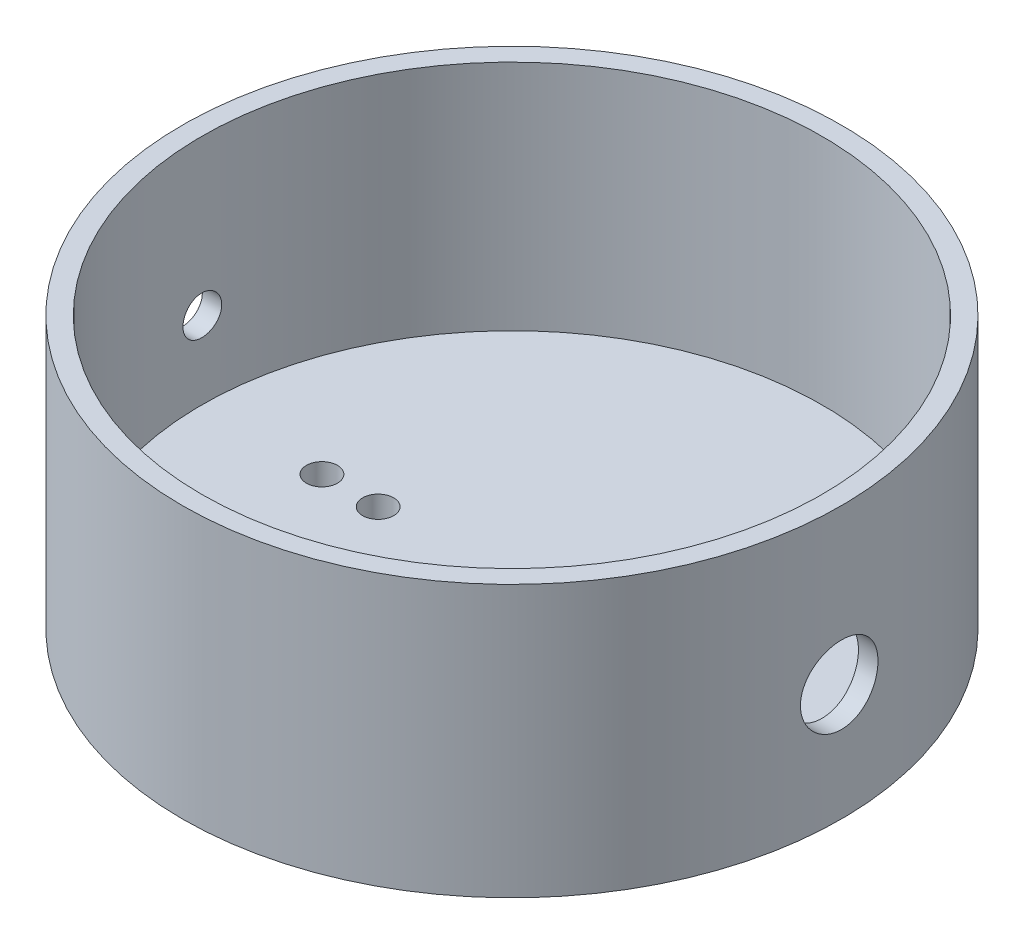
ISO-10303-21;
HEADER;
FILE_DESCRIPTION(('STEP AP214'),'2;1');
FILE_NAME('part.step','',(''),(''),'','','');
FILE_SCHEMA(('AUTOMOTIVE_DESIGN { 1 0 10303 214 1 1 1 1 }'));
ENDSEC;
DATA;
#1=APPLICATION_CONTEXT('core data for automotive mechanical design processes');
#2=APPLICATION_PROTOCOL_DEFINITION('international standard','automotive_design',2000,#1);
#3=PRODUCT_CONTEXT('',#1,'mechanical');
#4=PRODUCT('Part','Part','',(#3));
#5=PRODUCT_RELATED_PRODUCT_CATEGORY('part','',(#4));
#6=PRODUCT_DEFINITION_FORMATION('','',#4);
#7=PRODUCT_DEFINITION_CONTEXT('part definition',#1,'design');
#8=PRODUCT_DEFINITION('design','',#6,#7);
#9=PRODUCT_DEFINITION_SHAPE('','',#8);
#10=(LENGTH_UNIT() NAMED_UNIT(*) SI_UNIT(.MILLI.,.METRE.));
#11=(NAMED_UNIT(*) PLANE_ANGLE_UNIT() SI_UNIT($,.RADIAN.));
#12=(NAMED_UNIT(*) SI_UNIT($,.STERADIAN.) SOLID_ANGLE_UNIT());
#13=UNCERTAINTY_MEASURE_WITH_UNIT(LENGTH_MEASURE(1.E-05),#10,'distance_accuracy_value','');
#14=(GEOMETRIC_REPRESENTATION_CONTEXT(3) GLOBAL_UNCERTAINTY_ASSIGNED_CONTEXT((#13)) GLOBAL_UNIT_ASSIGNED_CONTEXT((#10,
#11,#12)) REPRESENTATION_CONTEXT('',''));
#15=CARTESIAN_POINT('',(0.,0.,0.));
#16=DIRECTION('',(0.,0.,1.));
#17=DIRECTION('',(1.,0.,0.));
#18=AXIS2_PLACEMENT_3D('',#15,#16,#17);
#19=CARTESIAN_POINT('',(0.,5.,0.));
#20=DIRECTION('',(0.,-1.,0.));
#21=DIRECTION('',(0.,0.,-1.));
#22=AXIS2_PLACEMENT_3D('',#19,#20,#21);
#23=CYLINDRICAL_SURFACE('',#22,42.5);
#24=CARTESIAN_POINT('',(-42.4264068711928,15.,-2.5));
#25=CARTESIAN_POINT('',(-42.4264078570195,14.8597043001764,-2.49999382069607));
#26=CARTESIAN_POINT('',(-42.4271102485507,14.7193099656528,-2.4881505905154));
#27=CARTESIAN_POINT('',(-42.4298443023052,14.4423967781573,-2.44107495642093));
#28=CARTESIAN_POINT('',(-42.4318775177309,14.3058826482556,-2.40581522244134));
#29=CARTESIAN_POINT('',(-42.4370421207025,14.0407811498357,-2.31292183504433));
#30=CARTESIAN_POINT('',(-42.4401729347905,13.9121896831655,-2.25529986345477));
#31=CARTESIAN_POINT('',(-42.4471792366281,13.6665382005797,-2.11933627438461));
#32=CARTESIAN_POINT('',(-42.4510545521376,13.5494755269407,-2.04099944769993));
#33=CARTESIAN_POINT('',(-42.4591191176081,13.3300128651671,-1.86571366309539));
#34=CARTESIAN_POINT('',(-42.4633087344733,13.2276304330584,-1.76874273962355));
#35=CARTESIAN_POINT('',(-42.4715263980762,13.0405846084043,-1.55898636943882));
#36=CARTESIAN_POINT('',(-42.4755544381152,12.9559219498848,-1.44620026791907));
#37=CARTESIAN_POINT('',(-42.482998132701,12.8066666987091,-1.20791823890995));
#38=CARTESIAN_POINT('',(-42.4864133514463,12.7420883650664,-1.08241336506772));
#39=CARTESIAN_POINT('',(-42.4922427554677,12.6349262647477,-0.822319232189798));
#40=CARTESIAN_POINT('',(-42.494656950462,12.592342284542,-0.687730061362301));
#41=CARTESIAN_POINT('',(-42.4982097643916,12.5304256739497,-0.413454591796973));
#42=CARTESIAN_POINT('',(-42.4993498707064,12.511065929495,-0.273774433523604));
#43=CARTESIAN_POINT('',(-42.5002310415814,12.496063627122,0.00685733853192212));
#44=CARTESIAN_POINT('',(-42.4999721204025,12.5004208274484,0.147808939339185));
#45=CARTESIAN_POINT('',(-42.4980856567521,12.5327063230398,0.426798862719913));
#46=CARTESIAN_POINT('',(-42.4964598081053,12.5606054465476,0.564840574170226));
#47=CARTESIAN_POINT('',(-42.492024511873,12.6391375806725,0.83427807529489));
#48=CARTESIAN_POINT('',(-42.4892150579319,12.689770713365,0.965673829278089));
#49=CARTESIAN_POINT('',(-42.4827260051383,12.8123666826543,1.21818330971254));
#50=CARTESIAN_POINT('',(-42.4790458663383,12.8843427619376,1.3392905922654));
#51=CARTESIAN_POINT('',(-42.4712296999799,13.0475718427678,1.56771494894009));
#52=CARTESIAN_POINT('',(-42.4670936678973,13.1388250356279,1.67503188618435));
#53=CARTESIAN_POINT('',(-42.4588238943725,13.3381828065811,1.87299944126679));
#54=CARTESIAN_POINT('',(-42.4546901658902,13.4463127011079,1.96362456738247));
#55=CARTESIAN_POINT('',(-42.4468973052562,13.6762656924409,2.12543949407809));
#56=CARTESIAN_POINT('',(-42.4432381732714,13.7980887940613,2.196629287825));
#57=CARTESIAN_POINT('',(-42.4368076458013,14.0519860337355,2.31755078766452));
#58=CARTESIAN_POINT('',(-42.4340362932275,14.1840606669218,2.36728145655394));
#59=CARTESIAN_POINT('',(-42.4296954187484,14.454704579978,2.44385561766896));
#60=CARTESIAN_POINT('',(-42.4281258843259,14.5932737921894,2.47069934826726));
#61=CARTESIAN_POINT('',(-42.4263679821085,14.8727511270737,2.50070595175883));
#62=CARTESIAN_POINT('',(-42.4261775486014,15.0136554346153,2.50390424256846));
#63=CARTESIAN_POINT('',(-42.427193928478,15.2939985837111,2.48662168212214));
#64=CARTESIAN_POINT('',(-42.4284007354329,15.433437432005,2.46614093981395));
#65=CARTESIAN_POINT('',(-42.4320737044637,15.7067915614793,2.40211109266647));
#66=CARTESIAN_POINT('',(-42.4345389777362,15.8407106689832,2.35857826776428));
#67=CARTESIAN_POINT('',(-42.4404502941044,16.0993418741163,2.24969647773642));
#68=CARTESIAN_POINT('',(-42.4438963450773,16.2240538977891,2.18434733739359));
#69=CARTESIAN_POINT('',(-42.4513858733169,16.4608935899571,2.0335973061375));
#70=CARTESIAN_POINT('',(-42.455430056098,16.5730061183306,1.94817266450964));
#71=CARTESIAN_POINT('',(-42.4636576065315,16.7813119104551,1.75973113167618));
#72=CARTESIAN_POINT('',(-42.4678409753961,16.8775050355068,1.65671408721101));
#73=CARTESIAN_POINT('',(-42.4758814966068,17.0513608910064,1.43585968885814));
#74=CARTESIAN_POINT('',(-42.4797382419494,17.1290007154245,1.31800428659472));
#75=CARTESIAN_POINT('',(-42.4866850712182,17.2633893657794,1.07090956169384));
#76=CARTESIAN_POINT('',(-42.4897751594339,17.3201383086034,0.941670302755459));
#77=CARTESIAN_POINT('',(-42.4948385237127,17.4110943907858,0.675561020431282));
#78=CARTESIAN_POINT('',(-42.4968125203618,17.4453160768471,0.538695983361276));
#79=CARTESIAN_POINT('',(-42.4994241327085,17.4902938331614,0.261150762104982));
#80=CARTESIAN_POINT('',(-42.5000617597742,17.5010501030309,0.120470610383584));
#81=CARTESIAN_POINT('',(-42.4999288221523,17.498789787394,-0.160484537393839));
#82=CARTESIAN_POINT('',(-42.499160382407,17.4858090748239,-0.30075982446973));
#83=CARTESIAN_POINT('',(-42.4963059653803,17.4365175779872,-0.577135569655357));
#84=CARTESIAN_POINT('',(-42.4942199857248,17.4002067516791,-0.713236020241449));
#85=CARTESIAN_POINT('',(-42.4889650214136,17.305293642282,-0.977404699258213));
#86=CARTESIAN_POINT('',(-42.4857960388101,17.2466914014315,-1.10547294290799));
#87=CARTESIAN_POINT('',(-42.4787310597193,17.1088642540061,-1.34995674095591));
#88=CARTESIAN_POINT('',(-42.4748350831844,17.0296399133852,-1.46637261502091));
#89=CARTESIAN_POINT('',(-42.4667475100763,16.8526858588465,-1.6844283370012));
#90=CARTESIAN_POINT('',(-42.4625555079513,16.754930436373,-1.78604730638879));
#91=CARTESIAN_POINT('',(-42.4543514714737,16.543719429491,-1.97146637450623));
#92=CARTESIAN_POINT('',(-42.4503394814903,16.4302600022167,-2.05526209900834));
#93=CARTESIAN_POINT('',(-42.4429445090164,16.1907448984061,-2.20271081735825));
#94=CARTESIAN_POINT('',(-42.4395622559455,16.0646748716378,-2.26634051218411));
#95=CARTESIAN_POINT('',(-42.433819174436,15.8037135794594,-2.3714525700203));
#96=CARTESIAN_POINT('',(-42.431457147064,15.6688328839112,-2.41296094272702));
#97=CARTESIAN_POINT('',(-42.4286426715959,15.4442690628895,-2.46183209483964));
#98=CARTESIAN_POINT('',(-42.4278079774903,15.3560384887053,-2.47612662547874));
#99=CARTESIAN_POINT('',(-42.426689763893,15.1785519282037,-2.49521253878567));
#100=CARTESIAN_POINT('',(-42.4264062437301,15.0892959431351,-2.50000393302698));
#101=CARTESIAN_POINT('',(-42.4264068711928,15.,-2.5));
#102=B_SPLINE_CURVE_WITH_KNOTS('',3,(#24,#25,#26,#27,#28,#29,#30,#31,#32,#33,#34,#35,#36,#37,
#38,#39,#40,#41,#42,#43,#44,#45,#46,#47,#48,#49,#50,#51,#52,#53,#54,#55,#56,#57,#58,#59,#60,#61,
#62,#63,#64,#65,#66,#67,#68,#69,#70,#71,#72,#73,#74,#75,#76,#77,#78,#79,#80,#81,#82,#83,#84,#85,
#86,#87,#88,#89,#90,#91,#92,#93,#94,#95,#96,#97,#98,#99,#100,#101),.UNSPECIFIED.,.T.,.F.,(4,2,2,
2,2,2,2,2,2,2,2,2,2,2,2,2,2,2,2,2,2,2,2,2,2,2,2,2,2,2,2,2,2,2,2,2,2,2,4),(0.,0.420561120416397,
0.841613954303946,1.26244712948578,1.68318306212284,2.10441802759387,2.52567043890264,
2.94722124231487,3.36876795307322,3.78982203170134,4.210871818381,4.63140062996588,
5.05193169970001,5.4727242448411,5.89352096628162,6.31495509401274,6.73638936991081,
7.15784401308977,7.57929426666848,8.00011311224769,8.42093002163786,8.84145013554994,
9.26197362693925,9.68299715391401,10.104024348903,10.5255686919896,10.9471106764483,
11.3683801875622,11.7896461149885,12.2102759228796,12.6309064887603,13.0515362576232,
13.4721544839179,13.8933605707046,14.3146699120255,14.7364642575989,15.1577615676481,
15.4254422426562,15.6931225916671),.UNSPECIFIED.);
#103=CARTESIAN_POINT('',(-42.4264068711928,15.,-2.5));
#104=VERTEX_POINT('',#103);
#105=EDGE_CURVE('E187',#104,#104,#102,.T.);
#106=ORIENTED_EDGE('',*,*,#105,.F.);
#107=EDGE_LOOP('',(#106));
#108=FACE_BOUND('',#107,.T.);
#109=CARTESIAN_POINT('',(0.,0.,0.));
#110=DIRECTION('',(0.,1.,0.));
#111=DIRECTION('',(0.,0.,1.));
#112=AXIS2_PLACEMENT_3D('',#109,#110,#111);
#113=CIRCLE('',#112,42.5);
#114=CARTESIAN_POINT('',(0.,0.,42.5));
#115=VERTEX_POINT('',#114);
#116=EDGE_CURVE('E60',#115,#115,#113,.T.);
#117=ORIENTED_EDGE('',*,*,#116,.T.);
#118=EDGE_LOOP('',(#117));
#119=FACE_BOUND('',#118,.T.);
#120=CARTESIAN_POINT('',(0.,35.,0.));
#121=DIRECTION('',(0.,1.,0.));
#122=DIRECTION('',(0.,0.,1.));
#123=AXIS2_PLACEMENT_3D('',#120,#121,#122);
#124=CIRCLE('',#123,42.5);
#125=CARTESIAN_POINT('',(0.,35.,42.5));
#126=VERTEX_POINT('',#125);
#127=EDGE_CURVE('E252',#126,#126,#124,.T.);
#128=ORIENTED_EDGE('',*,*,#127,.F.);
#129=EDGE_LOOP('',(#128));
#130=FACE_BOUND('',#129,.T.);
#131=CARTESIAN_POINT('',(42.2048575403353,15.,5.));
#132=CARTESIAN_POINT('',(42.2048570426154,14.8600470304673,5.00000153220892));
#133=CARTESIAN_POINT('',(42.2055550887369,14.7201168221649,4.99412181150468));
#134=CARTESIAN_POINT('',(42.2083262928634,14.4412116689668,4.97064763379723));
#135=CARTESIAN_POINT('',(42.2103997683703,14.3022369521209,4.95305047195592));
#136=CARTESIAN_POINT('',(42.2158651113569,14.0261765076074,4.90624962764263));
#137=CARTESIAN_POINT('',(42.2192579831723,13.8890923015218,4.87703710307672));
#138=CARTESIAN_POINT('',(42.2272657855913,13.617841989659,4.80720904071436));
#139=CARTESIAN_POINT('',(42.2318811637412,13.4836769720698,4.76658932654084));
#140=CARTESIAN_POINT('',(42.2421957984114,13.2194034625113,4.67429629923434));
#141=CARTESIAN_POINT('',(42.2478939341414,13.0892909363885,4.62263440929847));
#142=CARTESIAN_POINT('',(42.2602171284125,12.8338431886225,4.50858482145079));
#143=CARTESIAN_POINT('',(42.2668425281619,12.708509747256,4.44619317333116));
#144=CARTESIAN_POINT('',(42.2808268333667,12.4636134464195,4.31118117911138));
#145=CARTESIAN_POINT('',(42.2881853295911,12.3440474221644,4.23856653046959));
#146=CARTESIAN_POINT('',(42.3034341792611,12.1113974890362,4.08356714245648));
#147=CARTESIAN_POINT('',(42.3113247290178,11.9983160015476,4.00117878828372));
#148=CARTESIAN_POINT('',(42.3274462472034,11.7790195703506,3.82687638132189));
#149=CARTESIAN_POINT('',(42.3356784708233,11.6728344577479,3.73492491108491));
#150=CARTESIAN_POINT('',(42.3522235943998,11.4685391337668,3.54238529197751));
#151=CARTESIAN_POINT('',(42.3605365230633,11.3704319228451,3.44179396200909));
#152=CARTESIAN_POINT('',(42.3770029500095,11.1830523894077,3.2327400377726));
#153=CARTESIAN_POINT('',(42.3851564983579,11.0937772555156,3.12427996741562));
#154=CARTESIAN_POINT('',(42.4010802245308,10.9246228026331,2.90017539146534));
#155=CARTESIAN_POINT('',(42.4088502598181,10.8447469619609,2.78452825025411));
#156=CARTESIAN_POINT('',(42.4238038287965,10.6948038909131,2.54658798854196));
#157=CARTESIAN_POINT('',(42.4309858096711,10.6247623014054,2.42427860788358));
#158=CARTESIAN_POINT('',(42.4445399092936,10.495211455903,2.17410523151314));
#159=CARTESIAN_POINT('',(42.4509117266968,10.4357061157093,2.046239192563));
#160=CARTESIAN_POINT('',(42.4626584772262,10.3277141735536,1.78593972538157));
#161=CARTESIAN_POINT('',(42.4680338039206,10.2792232197003,1.65350812495275));
#162=CARTESIAN_POINT('',(42.4776407097346,10.1935726490067,1.38497529059971));
#163=CARTESIAN_POINT('',(42.4818718683579,10.156417197466,1.24887272770441));
#164=CARTESIAN_POINT('',(42.4926156836359,10.0627492764228,0.837888295604477));
#165=CARTESIAN_POINT('',(42.4972488852707,10.0234109794409,0.558820016913617));
#166=CARTESIAN_POINT('',(42.5009262381868,9.99211235325839,-0.00184095790845066));
#167=CARTESIAN_POINT('',(42.4999705856276,10.0001503612284,-0.283433565093563));
#168=CARTESIAN_POINT('',(42.4926067149132,10.0631401056818,-0.839867831812226));
#169=CARTESIAN_POINT('',(42.4862254763745,10.1178597147736,-1.11473598413353));
#170=CARTESIAN_POINT('',(42.4687553702885,10.2723135102037,-1.65134958121404));
#171=CARTESIAN_POINT('',(42.4576664219929,10.3720484686641,-1.91309480079768));
#172=CARTESIAN_POINT('',(42.431981252298,10.6139467598215,-2.41676875487328));
#173=CARTESIAN_POINT('',(42.4173766819814,10.7562112894756,-2.6586484506143));
#174=CARTESIAN_POINT('',(42.3862955734946,11.0790579754328,-3.11518667208807));
#175=CARTESIAN_POINT('',(42.3698189592679,11.2596416888078,-3.32984409109713));
#176=CARTESIAN_POINT('',(42.3367216107521,11.6553025152432,-3.72720820997644));
#177=CARTESIAN_POINT('',(42.3201006079111,11.8705818723931,-3.90971357044532));
#178=CARTESIAN_POINT('',(42.2886865577819,12.3288262973919,-4.23602976084424));
#179=CARTESIAN_POINT('',(42.273893515109,12.5717914351387,-4.37984049307937));
#180=CARTESIAN_POINT('',(42.2478100922406,13.0786820803693,-4.6246927745134));
#181=CARTESIAN_POINT('',(42.236520937282,13.3426148793812,-4.72571936747723));
#182=CARTESIAN_POINT('',(42.2187479144864,13.8838608837259,-4.88196314747015));
#183=CARTESIAN_POINT('',(42.2122638423231,14.1611735195742,-4.93718228238001));
#184=CARTESIAN_POINT('',(42.2048719542076,14.7195324711417,-4.99997947193507));
#185=CARTESIAN_POINT('',(42.2039310360584,15.0005465579552,-5.00784034354875));
#186=CARTESIAN_POINT('',(42.2076445133811,15.5598877205241,-4.97644297673002));
#187=CARTESIAN_POINT('',(42.2122988035176,15.8382148467647,-4.93718562534562));
#188=CARTESIAN_POINT('',(42.2266481071554,16.3834412297679,-4.81290385798638));
#189=CARTESIAN_POINT('',(42.2363281472618,16.6503718977318,-4.72801536606907));
#190=CARTESIAN_POINT('',(42.2596261267638,17.1662088472801,-4.51502046731315));
#191=CARTESIAN_POINT('',(42.2732441894599,17.415114564193,-4.38691270724616));
#192=CARTESIAN_POINT('',(42.3029633901479,17.889118703514,-4.09041653963718));
#193=CARTESIAN_POINT('',(42.319075873195,18.1141000061161,-3.92184205071184));
#194=CARTESIAN_POINT('',(42.351932348192,18.5326761433634,-3.54946083559451));
#195=CARTESIAN_POINT('',(42.3686763618389,18.7262698984378,-3.34565289805049));
#196=CARTESIAN_POINT('',(42.4010105313895,19.0775636220605,-2.90736112545497));
#197=CARTESIAN_POINT('',(42.4165944607359,19.2350781749748,-2.67272816850211));
#198=CARTESIAN_POINT('',(42.4447598893091,19.5084601302471,-2.18016147643642));
#199=CARTESIAN_POINT('',(42.4573414430666,19.6243282890284,-1.92222816463431));
#200=CARTESIAN_POINT('',(42.4780582121798,19.8108248341617,-1.39106110309958));
#201=CARTESIAN_POINT('',(42.4862041012418,19.8815618922955,-1.11786584287677));
#202=CARTESIAN_POINT('',(42.4971704503958,19.9761229358952,-0.563220067490718));
#203=CARTESIAN_POINT('',(42.4999911218588,19.9999487833844,-0.281769880436242));
#204=CARTESIAN_POINT('',(42.5000044104807,20.000025425487,0.139272338487291));
#205=CARTESIAN_POINT('',(42.4993128387088,19.9941660938656,0.279082637609126));
#206=CARTESIAN_POINT('',(42.4965682638121,19.9707626249034,0.557694307697615));
#207=CARTESIAN_POINT('',(42.4945157672281,19.9532228350593,0.696496034633248));
#208=CARTESIAN_POINT('',(42.4891038080095,19.9065741252455,0.972157288315554));
#209=CARTESIAN_POINT('',(42.4857438695194,19.8774609929691,1.10901608909763));
#210=CARTESIAN_POINT('',(42.4778137528201,19.807895161758,1.37973383027605));
#211=CARTESIAN_POINT('',(42.4732440157097,19.7674465954669,1.51359384479053));
#212=CARTESIAN_POINT('',(42.4630212480011,19.6754955809448,1.7774307757936));
#213=CARTESIAN_POINT('',(42.4573681256156,19.6239921960753,1.9074073621884));
#214=CARTESIAN_POINT('',(42.4451393043683,19.5103259448639,2.16251058573239));
#215=CARTESIAN_POINT('',(42.4385639413194,19.4481669566951,2.28763896717307));
#216=CARTESIAN_POINT('',(42.4246699980669,19.3135951158399,2.53227030447962));
#217=CARTESIAN_POINT('',(42.4173511491634,19.2411785522538,2.65177120354273));
#218=CARTESIAN_POINT('',(42.4021789743024,19.0866477167913,2.88423002793997));
#219=CARTESIAN_POINT('',(42.3943258417194,19.0045369457339,2.9971902934287));
#220=CARTESIAN_POINT('',(42.3782517246235,18.8306342388839,3.21651176313942));
#221=CARTESIAN_POINT('',(42.370028767676,18.7387856402373,3.32282789929354));
#222=CARTESIAN_POINT('',(42.3534952931391,18.5465097748896,3.52731594713733));
#223=CARTESIAN_POINT('',(42.345184808445,18.4460856368794,3.62549080353377));
#224=CARTESIAN_POINT('',(42.328702604096,18.23726752952,3.81311057442721));
#225=CARTESIAN_POINT('',(42.3205309715699,18.1288687681043,3.90255016339666));
#226=CARTESIAN_POINT('',(42.3045658265566,17.9049532457131,4.07197125849128));
#227=CARTESIAN_POINT('',(42.2967721755548,17.7894391279902,4.15195624501672));
#228=CARTESIAN_POINT('',(42.2817522990114,17.5516096896802,4.30222602232549));
#229=CARTESIAN_POINT('',(42.2745283499737,17.4292701193496,4.37247266995778));
#230=CARTESIAN_POINT('',(42.2608909854347,17.1791051056456,4.5023725561685));
#231=CARTESIAN_POINT('',(42.2544772729778,17.0512816952705,4.56202967912647));
#232=CARTESIAN_POINT('',(42.2426469295632,16.7911131986574,4.6703048845762));
#233=CARTESIAN_POINT('',(42.2372295084045,16.6587717954797,4.71893172286525));
#234=CARTESIAN_POINT('',(42.2275431744965,16.3904616111599,4.80483725951315));
#235=CARTESIAN_POINT('',(42.2232739871718,16.2544937057814,4.84211867116875));
#236=CARTESIAN_POINT('',(42.2147996729675,15.9341902454513,4.91553698263409));
#237=CARTESIAN_POINT('',(42.211087042827,15.7487931298981,4.94717868566831));
#238=CARTESIAN_POINT('',(42.2061163182805,15.3755836751247,4.98940909889525));
#239=CARTESIAN_POINT('',(42.2048582081135,15.1877713514209,4.99999794427413));
#240=CARTESIAN_POINT('',(42.2048575403353,15.,5.));
#241=B_SPLINE_CURVE_WITH_KNOTS('',3,(#131,#132,#133,#134,#135,#136,#137,#138,#139,#140,#141,
#142,#143,#144,#145,#146,#147,#148,#149,#150,#151,#152,#153,#154,#155,#156,#157,#158,#159,#160,
#161,#162,#163,#164,#165,#166,#167,#168,#169,#170,#171,#172,#173,#174,#175,#176,#177,#178,#179,
#180,#181,#182,#183,#184,#185,#186,#187,#188,#189,#190,#191,#192,#193,#194,#195,#196,#197,#198,
#199,#200,#201,#202,#203,#204,#205,#206,#207,#208,#209,#210,#211,#212,#213,#214,#215,#216,#217,
#218,#219,#220,#221,#222,#223,#224,#225,#226,#227,#228,#229,#230,#231,#232,#233,#234,#235,#236,
#237,#238,#239,#240),.UNSPECIFIED.,.T.,.F.,(4,2,2,2,2,2,2,2,2,2,2,2,2,2,2,2,2,2,2,2,2,2,2,2,2,2,
2,2,2,2,2,2,2,2,2,2,2,2,2,2,2,2,2,2,2,2,2,2,2,2,2,2,2,2,4),(0.,0.419694606038879,
0.839486127408579,1.25959782511688,1.67986353424059,2.099696562257,2.51968448583806,
2.93943926258083,3.35934977234266,3.7809699158299,4.20274596602153,4.6243873239399,
5.04618422771718,5.46906123504267,5.89209507638733,6.31496148106452,6.73798308394638,
7.57918339412234,8.42035417974517,9.25736640596016,10.094392989503,10.9334273061514,
11.7724957228746,12.616644888449,13.460796185283,14.3052423326066,15.1496525695169,
15.989015067106,16.8283617630985,17.6652219932154,18.5021084284992,19.3429194974868,
20.1837594799321,21.028828260691,21.8738816916941,22.7168925502362,23.5598699468921,
23.9792660026561,24.398506045306,24.8178988171165,25.237138886256,25.6564144902597,
26.075537819033,26.4948131638446,26.9139375584043,27.3356506552624,27.757210546766,
28.1790258620898,28.6006854132215,29.0239524825195,29.4470639694922,29.8698384076192,
30.2925116582232,30.8556088877206,31.4187025014044),.UNSPECIFIED.);
#242=CARTESIAN_POINT('',(42.2048575403353,15.,5.));
#243=VERTEX_POINT('',#242);
#244=EDGE_CURVE('E207',#243,#243,#241,.T.);
#245=ORIENTED_EDGE('',*,*,#244,.F.);
#246=EDGE_LOOP('',(#245));
#247=FACE_BOUND('',#246,.T.);
#248=ADVANCED_FACE('F45',(#108,#119,#130,#247),#23,.T.);
#249=CARTESIAN_POINT('',(0.,35.,0.));
#250=DIRECTION('',(0.,-1.,0.));
#251=DIRECTION('',(0.,0.,-1.));
#252=AXIS2_PLACEMENT_3D('',#249,#250,#251);
#253=CYLINDRICAL_SURFACE('',#252,40.);
#254=CARTESIAN_POINT('',(0.,5.,0.));
#255=DIRECTION('',(0.,1.,0.));
#256=DIRECTION('',(0.,0.,1.));
#257=AXIS2_PLACEMENT_3D('',#254,#255,#256);
#258=CIRCLE('',#257,40.);
#259=CARTESIAN_POINT('',(0.,5.,40.));
#260=VERTEX_POINT('',#259);
#261=EDGE_CURVE('E11',#260,#260,#258,.F.);
#262=ORIENTED_EDGE('',*,*,#261,.T.);
#263=EDGE_LOOP('',(#262));
#264=FACE_BOUND('',#263,.T.);
#265=CARTESIAN_POINT('',(0.,35.,0.));
#266=DIRECTION('',(0.,1.,0.));
#267=DIRECTION('',(0.,0.,1.));
#268=AXIS2_PLACEMENT_3D('',#265,#266,#267);
#269=CIRCLE('',#268,40.);
#270=CARTESIAN_POINT('',(0.,35.,40.));
#271=VERTEX_POINT('',#270);
#272=EDGE_CURVE('E114',#271,#271,#269,.T.);
#273=ORIENTED_EDGE('',*,*,#272,.T.);
#274=EDGE_LOOP('',(#273));
#275=FACE_BOUND('',#274,.T.);
#276=CARTESIAN_POINT('',(-39.9217985566783,15.,-2.5));
#277=CARTESIAN_POINT('',(-39.9217996028384,15.1402788817985,-2.49999382744797));
#278=CARTESIAN_POINT('',(-39.9225458845201,15.28065598716,-2.48815342460436));
#279=CARTESIAN_POINT('',(-39.9254507251542,15.5575340360392,-2.44108967758212));
#280=CARTESIAN_POINT('',(-39.9276109278974,15.6940302747931,-2.40583911661471));
#281=CARTESIAN_POINT('',(-39.9330979729181,15.9590958977774,-2.31297152505567));
#282=CARTESIAN_POINT('',(-39.9364241992923,16.0876694247765,-2.25536630066784));
#283=CARTESIAN_POINT('',(-39.9438677233292,16.3332885735862,-2.1194436803014));
#284=CARTESIAN_POINT('',(-39.9479848397925,16.4503368266574,-2.04113102701849));
#285=CARTESIAN_POINT('',(-39.9565532439935,16.6697924113712,-1.86588747429563));
#286=CARTESIAN_POINT('',(-39.9610049674716,16.7721801294309,-1.76893203224581));
#287=CARTESIAN_POINT('',(-39.9697369227542,16.9592403916914,-1.55920571950287));
#288=CARTESIAN_POINT('',(-39.9740171473996,17.0439121969861,-1.44643418947012));
#289=CARTESIAN_POINT('',(-39.9819275579911,17.1931969317837,-1.20816676790072));
#290=CARTESIAN_POINT('',(-39.9855572195596,17.2577937105829,-1.0826607383561));
#291=CARTESIAN_POINT('',(-39.9917529455212,17.3649912981831,-0.822558084440182));
#292=CARTESIAN_POINT('',(-39.9943190212986,17.4075923424229,-0.687961557389513));
#293=CARTESIAN_POINT('',(-39.9980954365577,17.4695349649899,-0.413686871910436));
#294=CARTESIAN_POINT('',(-39.9993075599123,17.4889071505166,-0.274015650808008));
#295=CARTESIAN_POINT('',(-40.0002454975904,17.503936668395,0.00660099158944559));
#296=CARTESIAN_POINT('',(-39.9999713286669,17.4995942680496,0.147546398504402));
#297=CARTESIAN_POINT('',(-39.9979690642736,17.4673431313152,0.426503171010614));
#298=CARTESIAN_POINT('',(-39.9962430001691,17.4394673206254,0.564518359854304));
#299=CARTESIAN_POINT('',(-39.9915336115285,17.3609917491253,0.833906725608854));
#300=CARTESIAN_POINT('',(-39.9885502795603,17.3103918539848,0.965279863251058));
#301=CARTESIAN_POINT('',(-39.9816587631379,17.1878671768829,1.21776060846134));
#302=CARTESIAN_POINT('',(-39.977749931945,17.1159274737385,1.3388609566623));
#303=CARTESIAN_POINT('',(-39.9694473243185,16.9527761431314,1.56727924609475));
#304=CARTESIAN_POINT('',(-39.965053542428,16.8615642987985,1.67459703220871));
#305=CARTESIAN_POINT('',(-39.9562666518295,16.6622718977895,1.8725960152895));
#306=CARTESIAN_POINT('',(-39.9518735571202,16.5541627625827,1.96324845014273));
#307=CARTESIAN_POINT('',(-39.9435908304691,16.324244729276,2.12512167874874));
#308=CARTESIAN_POINT('',(-39.9397011987276,16.2024358257245,2.19634246476873));
#309=CARTESIAN_POINT('',(-39.9328646364054,15.9485576855481,2.31732864802748));
#310=CARTESIAN_POINT('',(-39.929917759057,15.8164878700672,2.36709283378084));
#311=CARTESIAN_POINT('',(-39.9253009283417,15.5458452694127,2.44373333405017));
#312=CARTESIAN_POINT('',(-39.9236309599534,15.4072725607591,2.47060991781472));
#313=CARTESIAN_POINT('',(-39.9217590874033,15.1278086353026,2.50067645189514));
#314=CARTESIAN_POINT('',(-39.9215547053032,14.9869217357566,2.50390638295706));
#315=CARTESIAN_POINT('',(-39.9226305805451,14.7066081542068,2.48669238589381));
#316=CARTESIAN_POINT('',(-39.923910830162,14.5671814646087,2.46624858095216));
#317=CARTESIAN_POINT('',(-39.9278094294623,14.2938591792686,2.40230064823741));
#318=CARTESIAN_POINT('',(-39.9304267106386,14.1599592589454,2.35881493368864));
#319=CARTESIAN_POINT('',(-39.9367035178768,13.9013579630762,2.25003623405134));
#320=CARTESIAN_POINT('',(-39.9403630533907,13.7766566709633,2.18474305119486));
#321=CARTESIAN_POINT('',(-39.9483179814998,13.5398087983243,2.03410068351553));
#322=CARTESIAN_POINT('',(-39.9526142205588,13.4276792853312,1.94872470956939));
#323=CARTESIAN_POINT('',(-39.9613554452711,13.2193298503468,1.76037926090382));
#324=CARTESIAN_POINT('',(-39.9658004323807,13.1231100841631,1.65740961390568));
#325=CARTESIAN_POINT('',(-39.9743455092993,12.9491764263691,1.43662768089406));
#326=CARTESIAN_POINT('',(-39.9784451118168,12.8714884068436,1.31879499123951));
#327=CARTESIAN_POINT('',(-39.9858304686899,12.7370005652437,1.07173442538044));
#328=CARTESIAN_POINT('',(-39.9891162280652,12.680200614333,0.942506619466408));
#329=CARTESIAN_POINT('',(-39.9945013388482,12.5891462520859,0.676419240624109));
#330=CARTESIAN_POINT('',(-39.9966015517718,12.554875466209,0.539565289148661));
#331=CARTESIAN_POINT('',(-39.9993823561968,12.5097986678551,0.26203223893719));
#332=CARTESIAN_POINT('',(-40.0000629616651,12.4989924245192,0.121353177848803));
#333=CARTESIAN_POINT('',(-39.9999279053056,12.5011537058071,-0.159580632399616));
#334=CARTESIAN_POINT('',(-39.9991147918524,12.5140807400039,-0.299835696082919));
#335=CARTESIAN_POINT('',(-39.9960887960849,12.5632576755814,-0.576179672120269));
#336=CARTESIAN_POINT('',(-39.9938759113098,12.599507617965,-0.712268577149527));
#337=CARTESIAN_POINT('',(-39.9882991013659,12.6942922419541,-0.97642329572081));
#338=CARTESIAN_POINT('',(-39.9849351843808,12.7528267651218,-1.10448916629703));
#339=CARTESIAN_POINT('',(-39.977434000598,12.8905133140509,-1.34898068969619));
#340=CARTESIAN_POINT('',(-39.9732967538609,12.9696648050172,-1.46540664434515));
#341=CARTESIAN_POINT('',(-39.9647059053899,13.1464879914273,-1.68351872028575));
#342=CARTESIAN_POINT('',(-39.9602518110766,13.2441889359602,-1.78518110919647));
#343=CARTESIAN_POINT('',(-39.9515331844379,13.4552988076443,-1.97069679684236));
#344=CARTESIAN_POINT('',(-39.9472686987718,13.5687115732378,-2.05454573097965));
#345=CARTESIAN_POINT('',(-39.9394062039964,13.808155372966,-2.2021164629564));
#346=CARTESIAN_POINT('',(-39.9358090287046,13.9342018944831,-2.26581314930986));
#347=CARTESIAN_POINT('',(-39.9296991361868,14.1951312690418,-2.37106140842282));
#348=CARTESIAN_POINT('',(-39.9271851494619,14.3300035634445,-2.41263891838929));
#349=CARTESIAN_POINT('',(-39.9241851352796,14.5547508286241,-2.46166221765154));
#350=CARTESIAN_POINT('',(-39.9232941676087,14.6431730313309,-2.47602029498095));
#351=CARTESIAN_POINT('',(-39.9221005450037,14.8210501641121,-2.49519114849024));
#352=CARTESIAN_POINT('',(-39.9217978892507,14.9105050927489,-2.50000393795534));
#353=CARTESIAN_POINT('',(-39.9217985566783,15.,-2.5));
#354=B_SPLINE_CURVE_WITH_KNOTS('',3,(#276,#277,#278,#279,#280,#281,#282,#283,#284,#285,#286,
#287,#288,#289,#290,#291,#292,#293,#294,#295,#296,#297,#298,#299,#300,#301,#302,#303,#304,#305,
#306,#307,#308,#309,#310,#311,#312,#313,#314,#315,#316,#317,#318,#319,#320,#321,#322,#323,#324,
#325,#326,#327,#328,#329,#330,#331,#332,#333,#334,#335,#336,#337,#338,#339,#340,#341,#342,#343,
#344,#345,#346,#347,#348,#349,#350,#351,#352,#353),.UNSPECIFIED.,.T.,.F.,(4,2,2,2,2,2,2,2,2,2,2,
2,2,2,2,2,2,2,2,2,2,2,2,2,2,2,2,2,2,2,2,2,2,2,2,2,2,2,4),(0.,0.420509933089561,
0.841509611390609,1.26228724839615,1.68296859656054,2.10420759706281,2.52546416336053,
2.94705876566662,3.36864885519974,3.7896828295314,4.21071205812016,4.6311531972123,
5.05159682171562,5.47233512383409,5.89307816078844,6.31454066185841,6.73600333064838,
7.15748979300386,7.57897129694587,7.99974001311049,8.42050653986418,8.84093733013166,
9.26137193331297,9.68237058123042,10.1033733518384,10.5249604868351,10.9465450214638,
11.3678228022511,11.7890964382225,12.2096520233067,12.6302083477542,13.0507616822093,
13.4713041087787,13.8925152453829,14.3138294671207,14.7356666346089,15.1570080544424,
15.4252847141668,15.6935610005011),.UNSPECIFIED.);
#355=CARTESIAN_POINT('',(-39.9217985566783,15.,-2.5));
#356=VERTEX_POINT('',#355);
#357=EDGE_CURVE('E179',#356,#356,#354,.T.);
#358=ORIENTED_EDGE('',*,*,#357,.F.);
#359=EDGE_LOOP('',(#358));
#360=FACE_BOUND('',#359,.T.);
#361=CARTESIAN_POINT('',(39.6862696659689,15.,5.));
#362=CARTESIAN_POINT('',(39.6862691121621,14.860114682067,5.00000160621644));
#363=CARTESIAN_POINT('',(39.6870107577207,14.7202529314455,4.99412753069087));
#364=CARTESIAN_POINT('',(39.6899549375335,14.4414851892865,4.97067638205433));
#365=CARTESIAN_POINT('',(39.6921578029981,14.3025794216529,4.95309665565528));
#366=CARTESIAN_POINT('',(39.6979640132672,14.0266596676127,4.90634338900788));
#367=CARTESIAN_POINT('',(39.7015684017348,13.8896471699757,4.87716120846949));
#368=CARTESIAN_POINT('',(39.7100751500467,13.618539916647,4.80740736254757));
#369=CARTESIAN_POINT('',(39.7149779853889,13.484446249354,4.76683152441819));
#370=CARTESIAN_POINT('',(39.725934559813,13.220316880827,4.67464155939996));
#371=CARTESIAN_POINT('',(39.7319870811315,13.090277053856,4.62303910489468));
#372=CARTESIAN_POINT('',(39.7450763084551,12.8349708022601,4.50912356166886));
#373=CARTESIAN_POINT('',(39.7521133767826,12.7097061566393,4.44680652794275));
#374=CARTESIAN_POINT('',(39.7669663555683,12.4649398179421,4.31195814152151));
#375=CARTESIAN_POINT('',(39.7747818377143,12.345435008723,4.23943239705885));
#376=CARTESIAN_POINT('',(39.7909775925609,12.1128979389585,4.08462468371877));
#377=CARTESIAN_POINT('',(39.7993580738649,11.9998680978413,4.00233910280413));
#378=CARTESIAN_POINT('',(39.8164855967928,11.7806010781631,3.8282060089337));
#379=CARTESIAN_POINT('',(39.8252341564618,11.6743977868122,3.73631597227108));
#380=CARTESIAN_POINT('',(39.8428175438686,11.4700598036568,3.54389956532806));
#381=CARTESIAN_POINT('',(39.8516524023154,11.3719281105025,3.44337001352056));
#382=CARTESIAN_POINT('',(39.8691534366817,11.1844918665223,3.23443774379468));
#383=CARTESIAN_POINT('',(39.877819665332,11.0951845194971,3.1260375388863));
#384=CARTESIAN_POINT('',(39.8947456470219,10.9259573845215,2.90204868205505));
#385=CARTESIAN_POINT('',(39.9030052489455,10.8460410715148,2.78645739327682));
#386=CARTESIAN_POINT('',(39.9189053477936,10.6959797738317,2.54857670060144));
#387=CARTESIAN_POINT('',(39.9265439484259,10.625864280186,2.42626856073735));
#388=CARTESIAN_POINT('',(39.9409609448274,10.4961664771269,2.1760854164387));
#389=CARTESIAN_POINT('',(39.9477390203284,10.4365880861638,2.04820836302081));
#390=CARTESIAN_POINT('',(39.9602359657303,10.3284529887156,1.7878747517522));
#391=CARTESIAN_POINT('',(39.965955257206,10.2798918937441,1.65542004161812));
#392=CARTESIAN_POINT('',(39.9761783122051,10.1941058173046,1.38682919485889));
#393=CARTESIAN_POINT('',(39.9806816291952,10.1568849995999,1.25069172597728));
#394=CARTESIAN_POINT('',(39.9921145463994,10.0630691466482,0.839750036259438));
#395=CARTESIAN_POINT('',(39.99704953182,10.0236309172587,0.560750223667633));
#396=CARTESIAN_POINT('',(40.0009837593901,9.99211495618201,0.000203898704362825));
#397=CARTESIAN_POINT('',(39.9999832350481,10.0000353613631,-0.281342513046471));
#398=CARTESIAN_POINT('',(39.9921923269202,10.0627541989611,-0.837519242273738));
#399=CARTESIAN_POINT('',(39.9854342806971,10.1172908135149,-1.11217938456027));
#400=CARTESIAN_POINT('',(39.9669212872674,10.2713013366884,-1.64840735483694));
#401=CARTESIAN_POINT('',(39.9551662450662,10.3707760995996,-1.90997493382739));
#402=CARTESIAN_POINT('',(39.9279251108514,10.6121132590354,-2.41341681657713));
#403=CARTESIAN_POINT('',(39.9124290647218,10.7540889887541,-2.6552362374362));
#404=CARTESIAN_POINT('',(39.8794393934491,11.076316651135,-3.11171512286781));
#405=CARTESIAN_POINT('',(39.8619456767093,11.256570339235,-3.3263733410993));
#406=CARTESIAN_POINT('',(39.8267773471839,11.6517036570336,-3.72397600248036));
#407=CARTESIAN_POINT('',(39.8091023152141,11.8668115244092,-3.90669366417092));
#408=CARTESIAN_POINT('',(39.775681439692,12.324763108249,-4.23346571707134));
#409=CARTESIAN_POINT('',(39.7599356021869,12.5676069116494,-4.37751998708889));
#410=CARTESIAN_POINT('',(39.7321560520189,13.074338992552,-4.62288914294498));
#411=CARTESIAN_POINT('',(39.7201239181019,13.3382361602965,-4.72418585867369));
#412=CARTESIAN_POINT('',(39.7011648499798,13.8794789066636,-4.8809633099871));
#413=CARTESIAN_POINT('',(39.6942376697414,14.1568238364844,-4.93644625358275));
#414=CARTESIAN_POINT('',(39.6863177756737,14.7150863641317,-4.9997208638336));
#415=CARTESIAN_POINT('',(39.6852853488782,14.9959672463195,-5.00783168509867));
#416=CARTESIAN_POINT('',(39.6891668223623,15.5550838591889,-4.97697390535905));
#417=CARTESIAN_POINT('',(39.694080595899,15.833319646123,-4.93800630782777));
#418=CARTESIAN_POINT('',(39.7092645698093,16.3782915275899,-4.8143665759725));
#419=CARTESIAN_POINT('',(39.7195166543803,16.6450632319736,-4.72984898387612));
#420=CARTESIAN_POINT('',(39.7442073989291,17.1606483081134,-4.51766742184768));
#421=CARTESIAN_POINT('',(39.7586462059966,17.4094610485444,-4.39000193600035));
#422=CARTESIAN_POINT('',(39.790178628893,17.8835092935947,-4.09436410579493));
#423=CARTESIAN_POINT('',(39.807285861582,18.1086133529571,-3.92618246918586));
#424=CARTESIAN_POINT('',(39.8421847841799,18.5275130855409,-3.55458125469732));
#425=CARTESIAN_POINT('',(39.8599765006914,18.7213075403869,-3.35116030616056));
#426=CARTESIAN_POINT('',(39.8943617994191,19.073208458493,-2.91346441470191));
#427=CARTESIAN_POINT('',(39.9109479743442,19.2311052072579,-2.67902021574775));
#428=CARTESIAN_POINT('',(39.9409421645404,19.505276121606,-2.18674193191503));
#429=CARTESIAN_POINT('',(39.9543502438698,19.6215511261491,-1.92890831862279));
#430=CARTESIAN_POINT('',(39.9764461707812,19.8088367414723,-1.39791974787209));
#431=CARTESIAN_POINT('',(39.9851466471205,19.8799685444194,-1.12480797248286));
#432=CARTESIAN_POINT('',(39.996893760245,19.9753238262936,-0.570247277118735));
#433=CARTESIAN_POINT('',(39.9999406519839,19.9995494205023,-0.288798733679759));
#434=CARTESIAN_POINT('',(40.0000284206108,20.0002153320699,0.132181106690425));
#435=CARTESIAN_POINT('',(39.9993190539787,19.9945593411008,0.27190590667309));
#436=CARTESIAN_POINT('',(39.996455041752,19.9715769790331,0.550363437854881));
#437=CARTESIAN_POINT('',(39.9943009345053,19.9542549549909,0.689096519140061));
#438=CARTESIAN_POINT('',(39.9886045135969,19.9080553174465,0.964637468171644));
#439=CARTESIAN_POINT('',(39.9850616959402,19.8791735085519,1.10144461825899));
#440=CARTESIAN_POINT('',(39.9766897276768,19.8100829506207,1.37207701565807));
#441=CARTESIAN_POINT('',(39.9718610451618,19.7698783231089,1.5059033289078));
#442=CARTESIAN_POINT('',(39.961051726987,19.678430744652,1.769681467748));
#443=CARTESIAN_POINT('',(39.9550710847054,19.6271877302541,1.89963327106146));
#444=CARTESIAN_POINT('',(39.9421273110315,19.5140546081339,2.15470866241386));
#445=CARTESIAN_POINT('',(39.9351645365508,19.452168366428,2.27983398347656));
#446=CARTESIAN_POINT('',(39.920445981755,19.3181526777015,2.5244837397426));
#447=CARTESIAN_POINT('',(39.9126899116526,19.2460194837495,2.64400610479488));
#448=CARTESIAN_POINT('',(39.8966054692083,19.0920635808024,2.87653470303998));
#449=CARTESIAN_POINT('',(39.8882773032388,19.0102443582295,2.98954325918893));
#450=CARTESIAN_POINT('',(39.8712184674421,18.8368675888383,3.20907231341517));
#451=CARTESIAN_POINT('',(39.8624854116567,18.7452465876951,3.31554251832327));
#452=CARTESIAN_POINT('',(39.8449198729994,18.5534147426152,3.52035850406365));
#453=CARTESIAN_POINT('',(39.8360874273203,18.4532070247687,3.61870721622499));
#454=CARTESIAN_POINT('',(39.8185634314103,18.2448078618811,3.80669489983566));
#455=CARTESIAN_POINT('',(39.8098719696183,18.1366116252166,3.89632856797442));
#456=CARTESIAN_POINT('',(39.7928843415656,17.9130836018078,4.06615770596592));
#457=CARTESIAN_POINT('',(39.7845880305181,17.7977544647815,4.14635664886555));
#458=CARTESIAN_POINT('',(39.7685887068565,17.5602236268537,4.29710656946587));
#459=CARTESIAN_POINT('',(39.7608883616345,17.4379948360083,4.36761515662997));
#460=CARTESIAN_POINT('',(39.7463442749084,17.1880230543941,4.49804660545562));
#461=CARTESIAN_POINT('',(39.7395002194046,17.0602821081687,4.55797335079422));
#462=CARTESIAN_POINT('',(39.7268680592898,16.8002473148697,4.66679291131917));
#463=CARTESIAN_POINT('',(39.7210791307209,16.6679571171478,4.71569434340427));
#464=CARTESIAN_POINT('',(39.710719546941,16.3997197175976,4.80214988915873));
#465=CARTESIAN_POINT('',(39.7061486042115,16.2637733871954,4.83970668113183));
#466=CARTESIAN_POINT('',(39.697020871579,15.9420168126697,4.91410361107904));
#467=CARTESIAN_POINT('',(39.6930064464682,15.7550936630635,4.94628157385725));
#468=CARTESIAN_POINT('',(39.6876312285714,15.3787659342277,4.98922859994088));
#469=CARTESIAN_POINT('',(39.6862704156516,15.1893613738362,4.99999782568067));
#470=CARTESIAN_POINT('',(39.6862696659689,15.,5.));
#471=B_SPLINE_CURVE_WITH_KNOTS('',3,(#361,#362,#363,#364,#365,#366,#367,#368,#369,#370,#371,
#372,#373,#374,#375,#376,#377,#378,#379,#380,#381,#382,#383,#384,#385,#386,#387,#388,#389,#390,
#391,#392,#393,#394,#395,#396,#397,#398,#399,#400,#401,#402,#403,#404,#405,#406,#407,#408,#409,
#410,#411,#412,#413,#414,#415,#416,#417,#418,#419,#420,#421,#422,#423,#424,#425,#426,#427,#428,
#429,#430,#431,#432,#433,#434,#435,#436,#437,#438,#439,#440,#441,#442,#443,#444,#445,#446,#447,
#448,#449,#450,#451,#452,#453,#454,#455,#456,#457,#458,#459,#460,#461,#462,#463,#464,#465,#466,
#467,#468,#469,#470),.UNSPECIFIED.,.T.,.F.,(4,2,2,2,2,2,2,2,2,2,2,2,2,2,2,2,2,2,2,2,2,2,2,2,2,2,
2,2,2,2,2,2,2,2,2,2,2,2,2,2,2,2,2,2,2,2,2,2,2,2,2,2,2,2,4),(0.,0.419490216416563,
0.839075549923343,1.25897393356507,1.67902629933119,2.09863619608987,2.51840092134349,
2.9379359391874,3.35762671091483,3.77926140967716,4.20105204750604,4.6227085996356,
5.04452068835905,5.46757589305795,5.89078809072945,6.31383141442007,6.73702987853052,
7.57808001056306,8.41909705513609,9.25542137039469,10.0917615851697,10.93035215999,
11.768981201116,12.6133420192893,13.4577054841224,14.3024274065141,15.1471086148577,
15.9860924278516,16.8250583582762,17.6611955975886,18.497362215971,19.3379444626162,
20.1785594116301,21.0239657895808,21.8693551259115,22.7124652074327,23.5555372671902,
23.97465241842,24.3936114831816,24.8127227388202,25.2316816339981,25.6506429375723,
26.0694523789834,26.4884153596144,26.9072279931962,27.3289379901664,27.7504951059336,
28.1723071644079,28.5939634591784,29.0174092659641,29.4406993380089,29.8636574294589,
30.2865155885008,30.8543796615195,31.42223942597),.UNSPECIFIED.);
#472=CARTESIAN_POINT('',(39.6862696659689,15.,5.));
#473=VERTEX_POINT('',#472);
#474=EDGE_CURVE('E49',#473,#473,#471,.T.);
#475=ORIENTED_EDGE('',*,*,#474,.T.);
#476=EDGE_LOOP('',(#475));
#477=FACE_BOUND('',#476,.T.);
#478=ADVANCED_FACE('F173',(#264,#275,#360,#477),#253,.F.);
#479=CARTESIAN_POINT('',(0.,0.,0.));
#480=DIRECTION('',(0.,1.,0.));
#481=DIRECTION('',(0.,0.,1.));
#482=AXIS2_PLACEMENT_3D('',#479,#480,#481);
#483=PLANE('',#482);
#484=CARTESIAN_POINT('',(-25.9557743898593,0.,14.7938505172879));
#485=CARTESIAN_POINT('',(-27.3295364248855,0.,12.1453080062289));
#486=CARTESIAN_POINT('',(-28.5408611416074,0.,9.3136069401987));
#487=CARTESIAN_POINT('',(-29.,0.,6.35));
#488=B_SPLINE_CURVE_WITH_KNOTS('',3,(#484,#485,#486,#487),.UNSPECIFIED.,.F.,.F.,(4,4),(0.,
0.277553495444248),.UNSPECIFIED.);
#489=CARTESIAN_POINT('',(-25.9557743898593,0.,14.7938505172879));
#490=VERTEX_POINT('',#489);
#491=CARTESIAN_POINT('',(-29.,0.,6.35));
#492=VERTEX_POINT('',#491);
#493=EDGE_CURVE('E68',#490,#492,#488,.T.);
#494=ORIENTED_EDGE('',*,*,#493,.F.);
#495=CARTESIAN_POINT('',(-17.4036248318231,0.,9.61111591700386));
#496=DIRECTION('',(0.,-1.,0.));
#497=DIRECTION('',(0.,0.,-1.));
#498=AXIS2_PLACEMENT_3D('',#495,#496,#497);
#499=CIRCLE('',#498,9.99999999999999);
#500=CARTESIAN_POINT('',(-7.41061008423415,0.,9.98482202408446));
#501=VERTEX_POINT('',#500);
#502=EDGE_CURVE('E111',#490,#501,#499,.F.);
#503=ORIENTED_EDGE('',*,*,#502,.T.);
#504=CARTESIAN_POINT('',(-1.16155873490869,0.,0.));
#505=DIRECTION('',(0.,-1.,0.));
#506=DIRECTION('',(0.,0.,-1.));
#507=AXIS2_PLACEMENT_3D('',#504,#505,#506);
#508=CIRCLE('',#507,11.7791049583213);
#509=CARTESIAN_POINT('',(-7.81514458314579,0.,-9.71993358924264));
#510=VERTEX_POINT('',#509);
#511=EDGE_CURVE('E219',#510,#501,#508,.F.);
#512=ORIENTED_EDGE('',*,*,#511,.F.);
#513=CARTESIAN_POINT('',(-17.8151445831458,0.,-9.71993358924264));
#514=DIRECTION('',(0.,-1.,0.));
#515=DIRECTION('',(0.,0.,-1.));
#516=AXIS2_PLACEMENT_3D('',#513,#514,#515);
#517=CIRCLE('',#516,9.99999999999999);
#518=CARTESIAN_POINT('',(-25.1780473542711,0.,-16.4865917587496));
#519=VERTEX_POINT('',#518);
#520=EDGE_CURVE('E224',#510,#519,#517,.F.);
#521=ORIENTED_EDGE('',*,*,#520,.T.);
#522=CARTESIAN_POINT('',(-29.,0.,-6.35));
#523=CARTESIAN_POINT('',(-28.6990503841167,0.,-11.6004540782716));
#524=CARTESIAN_POINT('',(-25.1780473542711,0.,-16.4865917587496));
#525=B_SPLINE_CURVE_WITH_KNOTS('',2,(#522,#523,#524),.UNSPECIFIED.,.F.,.F.,(3,3),
(0.672682650204616,1.),.UNSPECIFIED.);
#526=CARTESIAN_POINT('',(-29.,0.,-6.35));
#527=VERTEX_POINT('',#526);
#528=EDGE_CURVE('E229',#527,#519,#525,.T.);
#529=ORIENTED_EDGE('',*,*,#528,.F.);
#530=CARTESIAN_POINT('',(-29.,0.,6.35));
#531=CARTESIAN_POINT('',(-30.0422721438966,0.,0.));
#532=CARTESIAN_POINT('',(-29.,0.,-6.35));
#533=B_SPLINE_CURVE_WITH_KNOTS('',2,(#530,#531,#532),.UNSPECIFIED.,.F.,.F.,(3,3),(0.,1.),.UNSPECIFIED.);
#534=EDGE_CURVE('E73',#492,#527,#533,.T.);
#535=ORIENTED_EDGE('',*,*,#534,.F.);
#536=EDGE_LOOP('',(#494,#503,#512,#521,#529,#535));
#537=FACE_BOUND('',#536,.T.);
#538=ORIENTED_EDGE('',*,*,#116,.F.);
#539=EDGE_LOOP('',(#538));
#540=FACE_BOUND('',#539,.T.);
#541=ADVANCED_FACE('F171',(#537,#540),#483,.F.);
#542=CARTESIAN_POINT('',(0.,35.,0.));
#543=DIRECTION('',(0.,1.,0.));
#544=DIRECTION('',(0.,0.,1.));
#545=AXIS2_PLACEMENT_3D('',#542,#543,#544);
#546=PLANE('',#545);
#547=ORIENTED_EDGE('',*,*,#272,.F.);
#548=EDGE_LOOP('',(#547));
#549=FACE_BOUND('',#548,.T.);
#550=ORIENTED_EDGE('',*,*,#127,.T.);
#551=EDGE_LOOP('',(#550));
#552=FACE_BOUND('',#551,.T.);
#553=ADVANCED_FACE('F169',(#549,#552),#546,.T.);
#554=CARTESIAN_POINT('',(0.,5.,0.));
#555=DIRECTION('',(0.,1.,0.));
#556=DIRECTION('',(0.,0.,1.));
#557=AXIS2_PLACEMENT_3D('',#554,#555,#556);
#558=PLANE('',#557);
#559=CARTESIAN_POINT('',(-17.25,5.,0.));
#560=DIRECTION('',(0.,1.,0.));
#561=DIRECTION('',(0.,0.,1.));
#562=AXIS2_PLACEMENT_3D('',#559,#560,#561);
#563=CIRCLE('',#562,2.);
#564=CARTESIAN_POINT('',(-17.25,5.,2.));
#565=VERTEX_POINT('',#564);
#566=EDGE_CURVE('E214',#565,#565,#563,.F.);
#567=ORIENTED_EDGE('',*,*,#566,.T.);
#568=EDGE_LOOP('',(#567));
#569=FACE_BOUND('',#568,.T.);
#570=CARTESIAN_POINT('',(-24.5,5.,-3.02492406123456E-12));
#571=DIRECTION('',(0.,1.,0.));
#572=DIRECTION('',(0.,0.,1.));
#573=AXIS2_PLACEMENT_3D('',#570,#571,#572);
#574=CIRCLE('',#573,2.00000000000089);
#575=CARTESIAN_POINT('',(-24.5,5.,1.99999999999786));
#576=VERTEX_POINT('',#575);
#577=EDGE_CURVE('E186',#576,#576,#574,.F.);
#578=ORIENTED_EDGE('',*,*,#577,.T.);
#579=EDGE_LOOP('',(#578));
#580=FACE_BOUND('',#579,.T.);
#581=ORIENTED_EDGE('',*,*,#261,.F.);
#582=EDGE_LOOP('',(#581));
#583=FACE_BOUND('',#582,.T.);
#584=ADVANCED_FACE('F158',(#569,#580,#583),#558,.T.);
#585=CARTESIAN_POINT('',(-17.4036248318231,-5.,9.61111591700386));
#586=DIRECTION('',(0.,1.,0.));
#587=DIRECTION('',(0.,0.,1.));
#588=AXIS2_PLACEMENT_3D('',#585,#586,#587);
#589=CYLINDRICAL_SURFACE('',#588,9.99999999999999);
#590=ORIENTED_EDGE('',*,*,#502,.F.);
#591=DIRECTION('',(0.,1.,0.));
#592=VECTOR('',#591,1.);
#593=CARTESIAN_POINT('',(-25.9557743898593,-5.,14.7938505172879));
#594=LINE('',#593,#592);
#595=CARTESIAN_POINT('',(-25.9557743898593,-5.,14.7938505172879));
#596=VERTEX_POINT('',#595);
#597=EDGE_CURVE('E105',#596,#490,#594,.T.);
#598=ORIENTED_EDGE('',*,*,#597,.F.);
#599=CARTESIAN_POINT('',(-17.4036248318231,-5.,9.61111591700386));
#600=DIRECTION('',(0.,-1.,0.));
#601=DIRECTION('',(0.,0.,-1.));
#602=AXIS2_PLACEMENT_3D('',#599,#600,#601);
#603=CIRCLE('',#602,9.99999999999999);
#604=CARTESIAN_POINT('',(-7.41061008423415,-5.,9.98482202408446));
#605=VERTEX_POINT('',#604);
#606=EDGE_CURVE('E110',#596,#605,#603,.F.);
#607=ORIENTED_EDGE('',*,*,#606,.T.);
#608=DIRECTION('',(0.,1.,0.));
#609=VECTOR('',#608,1.);
#610=CARTESIAN_POINT('',(-7.41061008423415,-5.,9.98482202408446));
#611=LINE('',#610,#609);
#612=EDGE_CURVE('E233',#605,#501,#611,.T.);
#613=ORIENTED_EDGE('',*,*,#612,.T.);
#614=EDGE_LOOP('',(#590,#598,#607,#613));
#615=FACE_BOUND('',#614,.T.);
#616=ADVANCED_FACE('F107',(#615),#589,.T.);
#617=CARTESIAN_POINT('',(-25.9557743898593,-5.,14.7938505172879));
#618=CARTESIAN_POINT('',(-27.3295364248855,-5.,12.1453080062289));
#619=CARTESIAN_POINT('',(-28.5408611416074,-5.,9.3136069401987));
#620=CARTESIAN_POINT('',(-29.,-5.,6.35));
#621=B_SPLINE_CURVE_WITH_KNOTS('',3,(#617,#618,#619,#620),.UNSPECIFIED.,.F.,.F.,(4,4),(0.,
0.277553495444248),.UNSPECIFIED.);
#622=DIRECTION('',(0.,1.,0.));
#623=VECTOR('',#622,1.);
#624=SURFACE_OF_LINEAR_EXTRUSION('',#621,#623);
#625=ORIENTED_EDGE('',*,*,#493,.T.);
#626=DIRECTION('',(0.,1.,0.));
#627=VECTOR('',#626,1.);
#628=CARTESIAN_POINT('',(-29.,-5.,6.35));
#629=LINE('',#628,#627);
#630=CARTESIAN_POINT('',(-29.,-5.,6.35));
#631=VERTEX_POINT('',#630);
#632=EDGE_CURVE('E115',#631,#492,#629,.T.);
#633=ORIENTED_EDGE('',*,*,#632,.F.);
#634=EDGE_CURVE('E119',#596,#631,#621,.T.);
#635=ORIENTED_EDGE('',*,*,#634,.F.);
#636=ORIENTED_EDGE('',*,*,#597,.T.);
#637=EDGE_LOOP('',(#625,#633,#635,#636));
#638=FACE_BOUND('',#637,.T.);
#639=ADVANCED_FACE('F120',(#638),#624,.F.);
#640=CARTESIAN_POINT('',(-29.,-5.,6.35));
#641=CARTESIAN_POINT('',(-30.0422721438966,-5.,0.));
#642=CARTESIAN_POINT('',(-29.,-5.,-6.35));
#643=B_SPLINE_CURVE_WITH_KNOTS('',2,(#640,#641,#642),.UNSPECIFIED.,.F.,.F.,(3,3),(0.,1.),.UNSPECIFIED.);
#644=DIRECTION('',(0.,1.,0.));
#645=VECTOR('',#644,1.);
#646=SURFACE_OF_LINEAR_EXTRUSION('',#643,#645);
#647=ORIENTED_EDGE('',*,*,#534,.T.);
#648=DIRECTION('',(0.,1.,0.));
#649=VECTOR('',#648,1.);
#650=CARTESIAN_POINT('',(-29.,-5.,-6.35));
#651=LINE('',#650,#649);
#652=CARTESIAN_POINT('',(-29.,-5.,-6.35));
#653=VERTEX_POINT('',#652);
#654=EDGE_CURVE('E243',#653,#527,#651,.T.);
#655=ORIENTED_EDGE('',*,*,#654,.F.);
#656=EDGE_CURVE('E124',#631,#653,#643,.T.);
#657=ORIENTED_EDGE('',*,*,#656,.F.);
#658=ORIENTED_EDGE('',*,*,#632,.T.);
#659=EDGE_LOOP('',(#647,#655,#657,#658));
#660=FACE_BOUND('',#659,.T.);
#661=ADVANCED_FACE('F154',(#660),#646,.F.);
#662=CARTESIAN_POINT('',(-29.,-5.,-6.35));
#663=CARTESIAN_POINT('',(-28.6990503841167,-5.,-11.6004540782716));
#664=CARTESIAN_POINT('',(-25.1780473542711,-5.,-16.4865917587496));
#665=B_SPLINE_CURVE_WITH_KNOTS('',2,(#662,#663,#664),.UNSPECIFIED.,.F.,.F.,(3,3),
(0.672682650204616,1.),.UNSPECIFIED.);
#666=DIRECTION('',(0.,1.,0.));
#667=VECTOR('',#666,1.);
#668=SURFACE_OF_LINEAR_EXTRUSION('',#665,#667);
#669=ORIENTED_EDGE('',*,*,#528,.T.);
#670=DIRECTION('',(0.,1.,0.));
#671=VECTOR('',#670,1.);
#672=CARTESIAN_POINT('',(-25.1780473542711,-5.,-16.4865917587496));
#673=LINE('',#672,#671);
#674=CARTESIAN_POINT('',(-25.1780473542711,-5.,-16.4865917587496));
#675=VERTEX_POINT('',#674);
#676=EDGE_CURVE('E239',#675,#519,#673,.T.);
#677=ORIENTED_EDGE('',*,*,#676,.F.);
#678=EDGE_CURVE('E466',#653,#675,#665,.T.);
#679=ORIENTED_EDGE('',*,*,#678,.F.);
#680=ORIENTED_EDGE('',*,*,#654,.T.);
#681=EDGE_LOOP('',(#669,#677,#679,#680));
#682=FACE_BOUND('',#681,.T.);
#683=ADVANCED_FACE('F317',(#682),#668,.F.);
#684=CARTESIAN_POINT('',(-17.8151445831458,-5.,-9.71993358924264));
#685=DIRECTION('',(0.,1.,0.));
#686=DIRECTION('',(0.,0.,1.));
#687=AXIS2_PLACEMENT_3D('',#684,#685,#686);
#688=CYLINDRICAL_SURFACE('',#687,9.99999999999999);
#689=ORIENTED_EDGE('',*,*,#520,.F.);
#690=DIRECTION('',(0.,1.,0.));
#691=VECTOR('',#690,1.);
#692=CARTESIAN_POINT('',(-7.81514458314579,-5.,-9.71993358924264));
#693=LINE('',#692,#691);
#694=CARTESIAN_POINT('',(-7.81514458314579,-5.,-9.71993358924264));
#695=VERTEX_POINT('',#694);
#696=EDGE_CURVE('E236',#695,#510,#693,.T.);
#697=ORIENTED_EDGE('',*,*,#696,.F.);
#698=CARTESIAN_POINT('',(-17.8151445831458,-5.,-9.71993358924264));
#699=DIRECTION('',(0.,-1.,0.));
#700=DIRECTION('',(0.,0.,-1.));
#701=AXIS2_PLACEMENT_3D('',#698,#699,#700);
#702=CIRCLE('',#701,9.99999999999999);
#703=EDGE_CURVE('E463',#695,#675,#702,.F.);
#704=ORIENTED_EDGE('',*,*,#703,.T.);
#705=ORIENTED_EDGE('',*,*,#676,.T.);
#706=EDGE_LOOP('',(#689,#697,#704,#705));
#707=FACE_BOUND('',#706,.T.);
#708=ADVANCED_FACE('F163',(#707),#688,.T.);
#709=CARTESIAN_POINT('',(-24.5,-5.,-3.02492406123456E-12));
#710=DIRECTION('',(0.,1.,0.));
#711=DIRECTION('',(0.,0.,1.));
#712=AXIS2_PLACEMENT_3D('',#709,#710,#711);
#713=CYLINDRICAL_SURFACE('',#712,2.00000000000089);
#714=CARTESIAN_POINT('',(-24.5,-5.,-3.02492406123456E-12));
#715=DIRECTION('',(0.,-1.,0.));
#716=DIRECTION('',(0.,0.,-1.));
#717=AXIS2_PLACEMENT_3D('',#714,#715,#716);
#718=CIRCLE('',#717,2.00000000000089);
#719=CARTESIAN_POINT('',(-24.5,-5.,-2.00000000000391));
#720=VERTEX_POINT('',#719);
#721=EDGE_CURVE('E132',#720,#720,#718,.F.);
#722=ORIENTED_EDGE('',*,*,#721,.F.);
#723=EDGE_LOOP('',(#722));
#724=FACE_BOUND('',#723,.T.);
#725=ORIENTED_EDGE('',*,*,#577,.F.);
#726=EDGE_LOOP('',(#725));
#727=FACE_BOUND('',#726,.T.);
#728=ADVANCED_FACE('F159',(#724,#727),#713,.F.);
#729=CARTESIAN_POINT('',(-17.25,-5.,0.));
#730=DIRECTION('',(0.,1.,0.));
#731=DIRECTION('',(0.,0.,1.));
#732=AXIS2_PLACEMENT_3D('',#729,#730,#731);
#733=CYLINDRICAL_SURFACE('',#732,2.);
#734=CARTESIAN_POINT('',(-17.25,-5.,0.));
#735=DIRECTION('',(0.,-1.,0.));
#736=DIRECTION('',(0.,0.,-1.));
#737=AXIS2_PLACEMENT_3D('',#734,#735,#736);
#738=CIRCLE('',#737,2.);
#739=CARTESIAN_POINT('',(-17.25,-5.,-2.));
#740=VERTEX_POINT('',#739);
#741=EDGE_CURVE('E136',#740,#740,#738,.F.);
#742=ORIENTED_EDGE('',*,*,#741,.F.);
#743=EDGE_LOOP('',(#742));
#744=FACE_BOUND('',#743,.T.);
#745=ORIENTED_EDGE('',*,*,#566,.F.);
#746=EDGE_LOOP('',(#745));
#747=FACE_BOUND('',#746,.T.);
#748=ADVANCED_FACE('F162',(#744,#747),#733,.F.);
#749=CARTESIAN_POINT('',(-1.16155873490869,-5.,0.));
#750=DIRECTION('',(0.,1.,0.));
#751=DIRECTION('',(0.,0.,1.));
#752=AXIS2_PLACEMENT_3D('',#749,#750,#751);
#753=CYLINDRICAL_SURFACE('',#752,11.7791049583213);
#754=ORIENTED_EDGE('',*,*,#511,.T.);
#755=ORIENTED_EDGE('',*,*,#612,.F.);
#756=CARTESIAN_POINT('',(-1.16155873490869,-5.,0.));
#757=DIRECTION('',(0.,-1.,0.));
#758=DIRECTION('',(0.,0.,-1.));
#759=AXIS2_PLACEMENT_3D('',#756,#757,#758);
#760=CIRCLE('',#759,11.7791049583213);
#761=EDGE_CURVE('E129',#695,#605,#760,.F.);
#762=ORIENTED_EDGE('',*,*,#761,.F.);
#763=ORIENTED_EDGE('',*,*,#696,.T.);
#764=EDGE_LOOP('',(#754,#755,#762,#763));
#765=FACE_BOUND('',#764,.T.);
#766=ADVANCED_FACE('F167',(#765),#753,.F.);
#767=CARTESIAN_POINT('',(0.,-5.,0.));
#768=DIRECTION('',(0.,-1.,0.));
#769=DIRECTION('',(0.,0.,-1.));
#770=AXIS2_PLACEMENT_3D('',#767,#768,#769);
#771=PLANE('',#770);
#772=ORIENTED_EDGE('',*,*,#741,.T.);
#773=EDGE_LOOP('',(#772));
#774=FACE_BOUND('',#773,.T.);
#775=ORIENTED_EDGE('',*,*,#721,.T.);
#776=EDGE_LOOP('',(#775));
#777=FACE_BOUND('',#776,.T.);
#778=ORIENTED_EDGE('',*,*,#606,.F.);
#779=ORIENTED_EDGE('',*,*,#634,.T.);
#780=ORIENTED_EDGE('',*,*,#656,.T.);
#781=ORIENTED_EDGE('',*,*,#678,.T.);
#782=ORIENTED_EDGE('',*,*,#703,.F.);
#783=ORIENTED_EDGE('',*,*,#761,.T.);
#784=EDGE_LOOP('',(#778,#779,#780,#781,#782,#783));
#785=FACE_BOUND('',#784,.T.);
#786=ADVANCED_FACE('F126',(#774,#777,#785),#771,.T.);
#787=CARTESIAN_POINT('',(-42.501,15.,0.));
#788=DIRECTION('',(1.,0.,0.));
#789=DIRECTION('',(0.,0.,-1.));
#790=AXIS2_PLACEMENT_3D('',#787,#788,#789);
#791=CYLINDRICAL_SURFACE('',#790,2.5);
#792=ORIENTED_EDGE('',*,*,#357,.T.);
#793=EDGE_LOOP('',(#792));
#794=FACE_BOUND('',#793,.T.);
#795=ORIENTED_EDGE('',*,*,#105,.T.);
#796=EDGE_LOOP('',(#795));
#797=FACE_BOUND('',#796,.T.);
#798=ADVANCED_FACE('F189',(#794,#797),#791,.F.);
#799=CARTESIAN_POINT('',(50.,15.,0.));
#800=DIRECTION('',(-1.,0.,0.));
#801=DIRECTION('',(0.,0.,1.));
#802=AXIS2_PLACEMENT_3D('',#799,#800,#801);
#803=CYLINDRICAL_SURFACE('',#802,5.);
#804=ORIENTED_EDGE('',*,*,#474,.F.);
#805=EDGE_LOOP('',(#804));
#806=FACE_BOUND('',#805,.T.);
#807=ORIENTED_EDGE('',*,*,#244,.T.);
#808=EDGE_LOOP('',(#807));
#809=FACE_BOUND('',#808,.T.);
#810=ADVANCED_FACE('F193',(#806,#809),#803,.F.);
#811=CLOSED_SHELL('',(#248,#478,#541,#553,#584,#616,#639,#661,#683,#708,#728,#748,#766,#786,
#798,#810));
#812=MANIFOLD_SOLID_BREP('B2',#811);
#813=ADVANCED_BREP_SHAPE_REPRESENTATION('',(#18,#812),#14);
#814=SHAPE_DEFINITION_REPRESENTATION(#9,#813);
ENDSEC;
END-ISO-10303-21;
